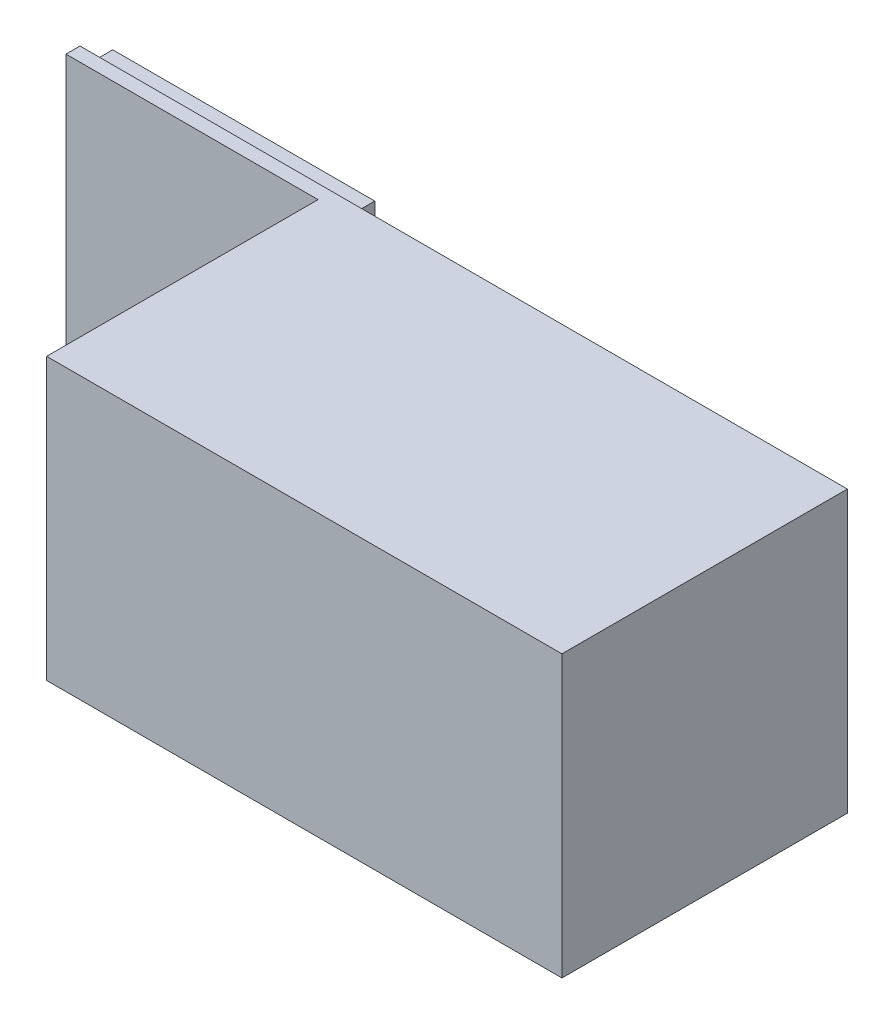
ISO-10303-21;
HEADER;
FILE_DESCRIPTION(('STEP AP214'),'2;1');
FILE_NAME('part.step','',(''),(''),'','','');
FILE_SCHEMA(('AUTOMOTIVE_DESIGN { 1 0 10303 214 1 1 1 1 }'));
ENDSEC;
DATA;
#1=APPLICATION_CONTEXT('core data for automotive mechanical design processes');
#2=APPLICATION_PROTOCOL_DEFINITION('international standard','automotive_design',2000,#1);
#3=PRODUCT_CONTEXT('',#1,'mechanical');
#4=PRODUCT('Part','Part','',(#3));
#5=PRODUCT_RELATED_PRODUCT_CATEGORY('part','',(#4));
#6=PRODUCT_DEFINITION_FORMATION('','',#4);
#7=PRODUCT_DEFINITION_CONTEXT('part definition',#1,'design');
#8=PRODUCT_DEFINITION('design','',#6,#7);
#9=PRODUCT_DEFINITION_SHAPE('','',#8);
#10=(LENGTH_UNIT() NAMED_UNIT(*) SI_UNIT(.MILLI.,.METRE.));
#11=(NAMED_UNIT(*) PLANE_ANGLE_UNIT() SI_UNIT($,.RADIAN.));
#12=(NAMED_UNIT(*) SI_UNIT($,.STERADIAN.) SOLID_ANGLE_UNIT());
#13=UNCERTAINTY_MEASURE_WITH_UNIT(LENGTH_MEASURE(1.E-05),#10,'distance_accuracy_value','');
#14=(GEOMETRIC_REPRESENTATION_CONTEXT(3) GLOBAL_UNCERTAINTY_ASSIGNED_CONTEXT((#13)) GLOBAL_UNIT_ASSIGNED_CONTEXT((#10,
#11,#12)) REPRESENTATION_CONTEXT('',''));
#15=CARTESIAN_POINT('',(0.,0.,0.));
#16=DIRECTION('',(0.,0.,1.));
#17=DIRECTION('',(1.,0.,0.));
#18=AXIS2_PLACEMENT_3D('',#15,#16,#17);
#19=CARTESIAN_POINT('',(-39.0023872675003,12.8992501149212,-3.5));
#20=DIRECTION('',(-1.,0.,0.));
#21=DIRECTION('',(0.,0.,1.));
#22=AXIS2_PLACEMENT_3D('',#19,#20,#21);
#23=PLANE('',#22);
#24=DIRECTION('',(0.,-1.,0.));
#25=VECTOR('',#24,1.);
#26=CARTESIAN_POINT('',(-39.0023872675003,0.,-1.75));
#27=LINE('',#26,#25);
#28=CARTESIAN_POINT('',(-39.0023872675003,12.8992501149212,-1.75));
#29=VERTEX_POINT('',#28);
#30=CARTESIAN_POINT('',(-39.0023872675003,-12.8992501149212,-1.75));
#31=VERTEX_POINT('',#30);
#32=EDGE_CURVE('E255',#29,#31,#27,.T.);
#33=ORIENTED_EDGE('',*,*,#32,.F.);
#34=DIRECTION('',(0.,0.,1.));
#35=VECTOR('',#34,1.);
#36=CARTESIAN_POINT('',(-39.0023872675003,12.8992501149212,-3.5));
#37=LINE('',#36,#35);
#38=CARTESIAN_POINT('',(-39.0023872675003,12.8992501149212,0.));
#39=VERTEX_POINT('',#38);
#40=EDGE_CURVE('E305',#29,#39,#37,.T.);
#41=ORIENTED_EDGE('',*,*,#40,.T.);
#42=DIRECTION('',(0.,-1.,0.));
#43=VECTOR('',#42,1.);
#44=CARTESIAN_POINT('',(-39.0023872675003,12.8992501149212,0.));
#45=LINE('',#44,#43);
#46=CARTESIAN_POINT('',(-39.0023872675003,-12.8992501149212,0.));
#47=VERTEX_POINT('',#46);
#48=EDGE_CURVE('E286',#39,#47,#45,.T.);
#49=ORIENTED_EDGE('',*,*,#48,.T.);
#50=DIRECTION('',(0.,0.,1.));
#51=VECTOR('',#50,1.);
#52=CARTESIAN_POINT('',(-39.0023872675003,-12.8992501149212,-3.5));
#53=LINE('',#52,#51);
#54=EDGE_CURVE('E292',#31,#47,#53,.T.);
#55=ORIENTED_EDGE('',*,*,#54,.F.);
#56=EDGE_LOOP('',(#33,#41,#49,#55));
#57=FACE_BOUND('',#56,.T.);
#58=ADVANCED_FACE('F47',(#57),#23,.F.);
#59=CARTESIAN_POINT('',(0.,0.,0.));
#60=DIRECTION('',(0.,0.,1.));
#61=DIRECTION('',(1.,0.,0.));
#62=AXIS2_PLACEMENT_3D('',#59,#60,#61);
#63=PLANE('',#62);
#64=DIRECTION('',(-1.,0.,0.));
#65=VECTOR('',#64,1.);
#66=CARTESIAN_POINT('',(-39.0023872675003,-12.8992501149212,0.));
#67=LINE('',#66,#65);
#68=CARTESIAN_POINT('',(-41.,-12.8992501149212,0.));
#69=VERTEX_POINT('',#68);
#70=EDGE_CURVE('E280',#47,#69,#67,.T.);
#71=ORIENTED_EDGE('',*,*,#70,.F.);
#72=ORIENTED_EDGE('',*,*,#48,.F.);
#73=DIRECTION('',(1.,0.,0.));
#74=VECTOR('',#73,1.);
#75=CARTESIAN_POINT('',(-41.,12.8992501149212,0.));
#76=LINE('',#75,#74);
#77=CARTESIAN_POINT('',(-41.,12.8992501149212,0.));
#78=VERTEX_POINT('',#77);
#79=EDGE_CURVE('E296',#78,#39,#76,.T.);
#80=ORIENTED_EDGE('',*,*,#79,.F.);
#81=DIRECTION('',(0.,-1.,0.));
#82=VECTOR('',#81,1.);
#83=CARTESIAN_POINT('',(-41.,15.,0.));
#84=LINE('',#83,#82);
#85=CARTESIAN_POINT('',(-41.,15.,0.));
#86=VERTEX_POINT('',#85);
#87=EDGE_CURVE('E336',#86,#78,#84,.T.);
#88=ORIENTED_EDGE('',*,*,#87,.F.);
#89=DIRECTION('',(-1.,0.,0.));
#90=VECTOR('',#89,1.);
#91=CARTESIAN_POINT('',(-41.,15.,0.));
#92=LINE('',#91,#90);
#93=CARTESIAN_POINT('',(41.,15.,0.));
#94=VERTEX_POINT('',#93);
#95=EDGE_CURVE('E332',#94,#86,#92,.T.);
#96=ORIENTED_EDGE('',*,*,#95,.F.);
#97=DIRECTION('',(0.,1.,0.));
#98=VECTOR('',#97,1.);
#99=CARTESIAN_POINT('',(41.,15.,0.));
#100=LINE('',#99,#98);
#101=CARTESIAN_POINT('',(41.,-15.,0.));
#102=VERTEX_POINT('',#101);
#103=EDGE_CURVE('E316',#102,#94,#100,.T.);
#104=ORIENTED_EDGE('',*,*,#103,.F.);
#105=DIRECTION('',(1.,0.,0.));
#106=VECTOR('',#105,1.);
#107=CARTESIAN_POINT('',(-41.,-15.,0.));
#108=LINE('',#107,#106);
#109=CARTESIAN_POINT('',(-41.,-15.,0.));
#110=VERTEX_POINT('',#109);
#111=EDGE_CURVE('E321',#110,#102,#108,.T.);
#112=ORIENTED_EDGE('',*,*,#111,.F.);
#113=EDGE_CURVE('E335',#69,#110,#84,.T.);
#114=ORIENTED_EDGE('',*,*,#113,.F.);
#115=EDGE_LOOP('',(#71,#72,#80,#88,#96,#104,#112,#114));
#116=FACE_BOUND('',#115,.T.);
#117=ADVANCED_FACE('F360',(#116),#63,.F.);
#118=CARTESIAN_POINT('',(41.,15.,1.5));
#119=DIRECTION('',(-1.,0.,0.));
#120=DIRECTION('',(0.,0.,1.));
#121=AXIS2_PLACEMENT_3D('',#118,#119,#120);
#122=PLANE('',#121);
#123=ORIENTED_EDGE('',*,*,#103,.T.);
#124=DIRECTION('',(0.,0.,-1.));
#125=VECTOR('',#124,1.);
#126=CARTESIAN_POINT('',(41.,15.,1.5));
#127=LINE('',#126,#125);
#128=CARTESIAN_POINT('',(41.,15.,30.5));
#129=VERTEX_POINT('',#128);
#130=EDGE_CURVE('E11',#129,#94,#127,.T.);
#131=ORIENTED_EDGE('',*,*,#130,.F.);
#132=DIRECTION('',(0.,1.,0.));
#133=VECTOR('',#132,1.);
#134=CARTESIAN_POINT('',(41.,15.,30.5));
#135=LINE('',#134,#133);
#136=CARTESIAN_POINT('',(41.,-15.,30.5));
#137=VERTEX_POINT('',#136);
#138=EDGE_CURVE('E241',#137,#129,#135,.T.);
#139=ORIENTED_EDGE('',*,*,#138,.F.);
#140=DIRECTION('',(0.,0.,-1.));
#141=VECTOR('',#140,1.);
#142=CARTESIAN_POINT('',(41.,-15.,1.5));
#143=LINE('',#142,#141);
#144=EDGE_CURVE('E328',#137,#102,#143,.T.);
#145=ORIENTED_EDGE('',*,*,#144,.T.);
#146=EDGE_LOOP('',(#123,#131,#139,#145));
#147=FACE_BOUND('',#146,.T.);
#148=ADVANCED_FACE('F49',(#147),#122,.F.);
#149=CARTESIAN_POINT('',(-41.,15.,1.5));
#150=DIRECTION('',(0.,-1.,0.));
#151=DIRECTION('',(0.,0.,-1.));
#152=AXIS2_PLACEMENT_3D('',#149,#150,#151);
#153=PLANE('',#152);
#154=ORIENTED_EDGE('',*,*,#95,.T.);
#155=DIRECTION('',(0.,0.,-1.));
#156=VECTOR('',#155,1.);
#157=CARTESIAN_POINT('',(-41.,15.,1.5));
#158=LINE('',#157,#156);
#159=CARTESIAN_POINT('',(-41.,15.,1.5));
#160=VERTEX_POINT('',#159);
#161=EDGE_CURVE('E56',#160,#86,#158,.T.);
#162=ORIENTED_EDGE('',*,*,#161,.F.);
#163=DIRECTION('',(-1.,0.,0.));
#164=VECTOR('',#163,1.);
#165=CARTESIAN_POINT('',(-41.,15.,1.5));
#166=LINE('',#165,#164);
#167=CARTESIAN_POINT('',(-14.0640967757307,15.,1.5));
#168=VERTEX_POINT('',#167);
#169=EDGE_CURVE('E317',#168,#160,#166,.T.);
#170=ORIENTED_EDGE('',*,*,#169,.F.);
#171=DIRECTION('',(0.,0.,-1.));
#172=VECTOR('',#171,1.);
#173=CARTESIAN_POINT('',(-14.0640967757307,15.,30.5));
#174=LINE('',#173,#172);
#175=CARTESIAN_POINT('',(-14.0640967757307,15.,30.5));
#176=VERTEX_POINT('',#175);
#177=EDGE_CURVE('E251',#176,#168,#174,.T.);
#178=ORIENTED_EDGE('',*,*,#177,.F.);
#179=DIRECTION('',(-1.,0.,0.));
#180=VECTOR('',#179,1.);
#181=CARTESIAN_POINT('',(-14.0640967757307,15.,30.5));
#182=LINE('',#181,#180);
#183=EDGE_CURVE('E230',#129,#176,#182,.T.);
#184=ORIENTED_EDGE('',*,*,#183,.F.);
#185=ORIENTED_EDGE('',*,*,#130,.T.);
#186=EDGE_LOOP('',(#154,#162,#170,#178,#184,#185));
#187=FACE_BOUND('',#186,.T.);
#188=ADVANCED_FACE('F416',(#187),#153,.F.);
#189=CARTESIAN_POINT('',(-41.,15.,1.5));
#190=DIRECTION('',(1.,0.,0.));
#191=DIRECTION('',(0.,0.,-1.));
#192=AXIS2_PLACEMENT_3D('',#189,#190,#191);
#193=PLANE('',#192);
#194=ORIENTED_EDGE('',*,*,#87,.T.);
#195=DIRECTION('',(0.,0.,1.));
#196=VECTOR('',#195,1.);
#197=CARTESIAN_POINT('',(-41.,12.8992501149212,-3.5));
#198=LINE('',#197,#196);
#199=CARTESIAN_POINT('',(-41.,12.8992501149212,-3.5));
#200=VERTEX_POINT('',#199);
#201=EDGE_CURVE('E308',#200,#78,#198,.T.);
#202=ORIENTED_EDGE('',*,*,#201,.F.);
#203=DIRECTION('',(0.,1.,0.));
#204=VECTOR('',#203,1.);
#205=CARTESIAN_POINT('',(-41.,12.8992501149212,-3.5));
#206=LINE('',#205,#204);
#207=CARTESIAN_POINT('',(-41.,-12.8992501149212,-3.5));
#208=VERTEX_POINT('',#207);
#209=EDGE_CURVE('E285',#208,#200,#206,.T.);
#210=ORIENTED_EDGE('',*,*,#209,.F.);
#211=DIRECTION('',(0.,0.,1.));
#212=VECTOR('',#211,1.);
#213=CARTESIAN_POINT('',(-41.,-12.8992501149212,-3.5));
#214=LINE('',#213,#212);
#215=EDGE_CURVE('E312',#208,#69,#214,.T.);
#216=ORIENTED_EDGE('',*,*,#215,.T.);
#217=ORIENTED_EDGE('',*,*,#113,.T.);
#218=DIRECTION('',(0.,0.,-1.));
#219=VECTOR('',#218,1.);
#220=CARTESIAN_POINT('',(-41.,-15.,1.5));
#221=LINE('',#220,#219);
#222=CARTESIAN_POINT('',(-41.,-15.,1.5));
#223=VERTEX_POINT('',#222);
#224=EDGE_CURVE('E345',#223,#110,#221,.T.);
#225=ORIENTED_EDGE('',*,*,#224,.F.);
#226=DIRECTION('',(0.,-1.,0.));
#227=VECTOR('',#226,1.);
#228=CARTESIAN_POINT('',(-41.,15.,1.5));
#229=LINE('',#228,#227);
#230=EDGE_CURVE('E320',#160,#223,#229,.T.);
#231=ORIENTED_EDGE('',*,*,#230,.F.);
#232=ORIENTED_EDGE('',*,*,#161,.T.);
#233=EDGE_LOOP('',(#194,#202,#210,#216,#217,#225,#231,#232));
#234=FACE_BOUND('',#233,.T.);
#235=ADVANCED_FACE('F354',(#234),#193,.F.);
#236=CARTESIAN_POINT('',(-41.,-15.,1.5));
#237=DIRECTION('',(0.,1.,0.));
#238=DIRECTION('',(0.,0.,1.));
#239=AXIS2_PLACEMENT_3D('',#236,#237,#238);
#240=PLANE('',#239);
#241=ORIENTED_EDGE('',*,*,#111,.T.);
#242=ORIENTED_EDGE('',*,*,#144,.F.);
#243=DIRECTION('',(1.,0.,0.));
#244=VECTOR('',#243,1.);
#245=CARTESIAN_POINT('',(41.,-15.,30.5));
#246=LINE('',#245,#244);
#247=CARTESIAN_POINT('',(-14.0640967757307,-15.,30.5));
#248=VERTEX_POINT('',#247);
#249=EDGE_CURVE('E237',#248,#137,#246,.T.);
#250=ORIENTED_EDGE('',*,*,#249,.F.);
#251=DIRECTION('',(0.,0.,-1.));
#252=VECTOR('',#251,1.);
#253=CARTESIAN_POINT('',(-14.0640967757307,-15.,30.5));
#254=LINE('',#253,#252);
#255=CARTESIAN_POINT('',(-14.0640967757307,-15.,1.5));
#256=VERTEX_POINT('',#255);
#257=EDGE_CURVE('E245',#248,#256,#254,.T.);
#258=ORIENTED_EDGE('',*,*,#257,.T.);
#259=DIRECTION('',(1.,0.,0.));
#260=VECTOR('',#259,1.);
#261=CARTESIAN_POINT('',(-41.,-15.,1.5));
#262=LINE('',#261,#260);
#263=EDGE_CURVE('E324',#223,#256,#262,.T.);
#264=ORIENTED_EDGE('',*,*,#263,.F.);
#265=ORIENTED_EDGE('',*,*,#224,.T.);
#266=EDGE_LOOP('',(#241,#242,#250,#258,#264,#265));
#267=FACE_BOUND('',#266,.T.);
#268=ADVANCED_FACE('F410',(#267),#240,.F.);
#269=CARTESIAN_POINT('',(0.,0.,1.5));
#270=DIRECTION('',(0.,0.,1.));
#271=DIRECTION('',(1.,0.,0.));
#272=AXIS2_PLACEMENT_3D('',#269,#270,#271);
#273=PLANE('',#272);
#274=DIRECTION('',(0.,-1.,0.));
#275=VECTOR('',#274,1.);
#276=CARTESIAN_POINT('',(-14.0640967757307,-15.,1.5));
#277=LINE('',#276,#275);
#278=CARTESIAN_POINT('',(-14.0640967757307,14.0374053382993,1.5));
#279=VERTEX_POINT('',#278);
#280=EDGE_CURVE('E71',#168,#279,#277,.T.);
#281=ORIENTED_EDGE('',*,*,#280,.F.);
#282=ORIENTED_EDGE('',*,*,#169,.T.);
#283=ORIENTED_EDGE('',*,*,#230,.T.);
#284=ORIENTED_EDGE('',*,*,#263,.T.);
#285=CARTESIAN_POINT('',(-14.0640967757307,-14.1575543140905,1.5));
#286=VERTEX_POINT('',#285);
#287=EDGE_CURVE('E227',#286,#256,#277,.T.);
#288=ORIENTED_EDGE('',*,*,#287,.F.);
#289=DIRECTION('',(0.,-1.,0.));
#290=VECTOR('',#289,1.);
#291=CARTESIAN_POINT('',(-14.0640967757307,0.,1.5));
#292=LINE('',#291,#290);
#293=EDGE_CURVE('E175',#279,#286,#292,.T.);
#294=ORIENTED_EDGE('',*,*,#293,.F.);
#295=EDGE_LOOP('',(#281,#282,#283,#284,#288,#294));
#296=FACE_BOUND('',#295,.T.);
#297=ADVANCED_FACE('F408',(#296),#273,.T.);
#298=CARTESIAN_POINT('',(-39.0023872675003,-12.8992501149212,-3.5));
#299=DIRECTION('',(0.,1.,0.));
#300=DIRECTION('',(0.,0.,1.));
#301=AXIS2_PLACEMENT_3D('',#298,#299,#300);
#302=PLANE('',#301);
#303=ORIENTED_EDGE('',*,*,#70,.T.);
#304=ORIENTED_EDGE('',*,*,#215,.F.);
#305=DIRECTION('',(-1.,0.,0.));
#306=VECTOR('',#305,1.);
#307=CARTESIAN_POINT('',(-39.0023872675003,-12.8992501149212,-3.5));
#308=LINE('',#307,#306);
#309=CARTESIAN_POINT('',(-13.0023872675003,-12.8992501149212,-3.5));
#310=VERTEX_POINT('',#309);
#311=EDGE_CURVE('E281',#310,#208,#308,.T.);
#312=ORIENTED_EDGE('',*,*,#311,.F.);
#313=DIRECTION('',(0.,0.,-1.));
#314=VECTOR('',#313,1.);
#315=CARTESIAN_POINT('',(-13.0023872675003,-12.8992501149212,0.));
#316=LINE('',#315,#314);
#317=CARTESIAN_POINT('',(-13.0023872675003,-12.8992501149212,-1.75));
#318=VERTEX_POINT('',#317);
#319=EDGE_CURVE('E263',#318,#310,#316,.T.);
#320=ORIENTED_EDGE('',*,*,#319,.F.);
#321=DIRECTION('',(-1.,0.,0.));
#322=VECTOR('',#321,1.);
#323=CARTESIAN_POINT('',(-13.0023872675003,-12.8992501149212,-1.75));
#324=LINE('',#323,#322);
#325=EDGE_CURVE('E271',#318,#31,#324,.T.);
#326=ORIENTED_EDGE('',*,*,#325,.T.);
#327=ORIENTED_EDGE('',*,*,#54,.T.);
#328=EDGE_LOOP('',(#303,#304,#312,#320,#326,#327));
#329=FACE_BOUND('',#328,.T.);
#330=ADVANCED_FACE('F375',(#329),#302,.F.);
#331=CARTESIAN_POINT('',(-41.,12.8992501149212,-3.5));
#332=DIRECTION('',(0.,-1.,0.));
#333=DIRECTION('',(0.,0.,-1.));
#334=AXIS2_PLACEMENT_3D('',#331,#332,#333);
#335=PLANE('',#334);
#336=ORIENTED_EDGE('',*,*,#79,.T.);
#337=ORIENTED_EDGE('',*,*,#40,.F.);
#338=DIRECTION('',(-1.,0.,0.));
#339=VECTOR('',#338,1.);
#340=CARTESIAN_POINT('',(-13.0023872675003,12.8992501149212,-1.75));
#341=LINE('',#340,#339);
#342=CARTESIAN_POINT('',(-13.0023872675003,12.8992501149212,-1.75));
#343=VERTEX_POINT('',#342);
#344=EDGE_CURVE('E277',#343,#29,#341,.T.);
#345=ORIENTED_EDGE('',*,*,#344,.F.);
#346=DIRECTION('',(0.,0.,1.));
#347=VECTOR('',#346,1.);
#348=CARTESIAN_POINT('',(-13.0023872675003,12.8992501149212,0.));
#349=LINE('',#348,#347);
#350=CARTESIAN_POINT('',(-13.0023872675003,12.8992501149212,-3.5));
#351=VERTEX_POINT('',#350);
#352=EDGE_CURVE('E256',#351,#343,#349,.T.);
#353=ORIENTED_EDGE('',*,*,#352,.F.);
#354=DIRECTION('',(1.,0.,0.));
#355=VECTOR('',#354,1.);
#356=CARTESIAN_POINT('',(-41.,12.8992501149212,-3.5));
#357=LINE('',#356,#355);
#358=EDGE_CURVE('E289',#200,#351,#357,.T.);
#359=ORIENTED_EDGE('',*,*,#358,.F.);
#360=ORIENTED_EDGE('',*,*,#201,.T.);
#361=EDGE_LOOP('',(#336,#337,#345,#353,#359,#360));
#362=FACE_BOUND('',#361,.T.);
#363=ADVANCED_FACE('F365',(#362),#335,.F.);
#364=CARTESIAN_POINT('',(0.,0.,-3.5));
#365=DIRECTION('',(0.,0.,1.));
#366=DIRECTION('',(1.,0.,0.));
#367=AXIS2_PLACEMENT_3D('',#364,#365,#366);
#368=PLANE('',#367);
#369=ORIENTED_EDGE('',*,*,#311,.T.);
#370=ORIENTED_EDGE('',*,*,#209,.T.);
#371=ORIENTED_EDGE('',*,*,#358,.T.);
#372=DIRECTION('',(0.,1.,0.));
#373=VECTOR('',#372,1.);
#374=CARTESIAN_POINT('',(-13.0023872675003,0.,-3.5));
#375=LINE('',#374,#373);
#376=EDGE_CURVE('E267',#310,#351,#375,.T.);
#377=ORIENTED_EDGE('',*,*,#376,.F.);
#378=EDGE_LOOP('',(#369,#370,#371,#377));
#379=FACE_BOUND('',#378,.T.);
#380=ADVANCED_FACE('F372',(#379),#368,.F.);
#381=CARTESIAN_POINT('',(-13.0023872675003,0.,-1.75));
#382=DIRECTION('',(0.,0.,-1.));
#383=DIRECTION('',(-1.,0.,0.));
#384=AXIS2_PLACEMENT_3D('',#381,#382,#383);
#385=PLANE('',#384);
#386=ORIENTED_EDGE('',*,*,#32,.T.);
#387=ORIENTED_EDGE('',*,*,#325,.F.);
#388=DIRECTION('',(0.,-1.,0.));
#389=VECTOR('',#388,1.);
#390=CARTESIAN_POINT('',(-13.0023872675003,0.,-1.75));
#391=LINE('',#390,#389);
#392=EDGE_CURVE('E260',#343,#318,#391,.T.);
#393=ORIENTED_EDGE('',*,*,#392,.F.);
#394=ORIENTED_EDGE('',*,*,#344,.T.);
#395=EDGE_LOOP('',(#386,#387,#393,#394));
#396=FACE_BOUND('',#395,.T.);
#397=ADVANCED_FACE('F382',(#396),#385,.F.);
#398=CARTESIAN_POINT('',(-13.0023872675003,0.,0.));
#399=DIRECTION('',(1.,0.,0.));
#400=DIRECTION('',(0.,0.,-1.));
#401=AXIS2_PLACEMENT_3D('',#398,#399,#400);
#402=PLANE('',#401);
#403=ORIENTED_EDGE('',*,*,#352,.T.);
#404=ORIENTED_EDGE('',*,*,#392,.T.);
#405=ORIENTED_EDGE('',*,*,#319,.T.);
#406=ORIENTED_EDGE('',*,*,#376,.T.);
#407=EDGE_LOOP('',(#403,#404,#405,#406));
#408=FACE_BOUND('',#407,.T.);
#409=ADVANCED_FACE('F384',(#408),#402,.T.);
#410=CARTESIAN_POINT('',(-14.0640967757307,-15.,30.5));
#411=DIRECTION('',(1.,0.,0.));
#412=DIRECTION('',(0.,0.,-1.));
#413=AXIS2_PLACEMENT_3D('',#410,#411,#412);
#414=PLANE('',#413);
#415=ORIENTED_EDGE('',*,*,#280,.T.);
#416=DIRECTION('',(0.,0.,-1.));
#417=VECTOR('',#416,1.);
#418=CARTESIAN_POINT('',(-14.0640967757307,14.0374053382993,2.81738964945669));
#419=LINE('',#418,#417);
#420=CARTESIAN_POINT('',(-14.0640967757307,14.0374053382993,29.1700650063779));
#421=VERTEX_POINT('',#420);
#422=EDGE_CURVE('E208',#421,#279,#419,.T.);
#423=ORIENTED_EDGE('',*,*,#422,.F.);
#424=DIRECTION('',(0.,1.,0.));
#425=VECTOR('',#424,1.);
#426=CARTESIAN_POINT('',(-14.0640967757307,14.0374053382993,29.1700650063779));
#427=LINE('',#426,#425);
#428=CARTESIAN_POINT('',(-14.0640967757307,-14.1575543140905,29.1700650063779));
#429=VERTEX_POINT('',#428);
#430=EDGE_CURVE('E218',#429,#421,#427,.T.);
#431=ORIENTED_EDGE('',*,*,#430,.F.);
#432=DIRECTION('',(0.,0.,1.));
#433=VECTOR('',#432,1.);
#434=CARTESIAN_POINT('',(-14.0640967757307,-14.1575543140905,29.1700650063779));
#435=LINE('',#434,#433);
#436=EDGE_CURVE('E63',#286,#429,#435,.T.);
#437=ORIENTED_EDGE('',*,*,#436,.F.);
#438=ORIENTED_EDGE('',*,*,#287,.T.);
#439=ORIENTED_EDGE('',*,*,#257,.F.);
#440=DIRECTION('',(0.,-1.,0.));
#441=VECTOR('',#440,1.);
#442=CARTESIAN_POINT('',(-14.0640967757307,-15.,30.5));
#443=LINE('',#442,#441);
#444=EDGE_CURVE('E234',#176,#248,#443,.T.);
#445=ORIENTED_EDGE('',*,*,#444,.F.);
#446=ORIENTED_EDGE('',*,*,#177,.T.);
#447=EDGE_LOOP('',(#415,#423,#431,#437,#438,#439,#445,#446));
#448=FACE_BOUND('',#447,.T.);
#449=ADVANCED_FACE('F386',(#448),#414,.F.);
#450=CARTESIAN_POINT('',(0.,0.,30.5));
#451=DIRECTION('',(0.,0.,-1.));
#452=DIRECTION('',(-1.,0.,0.));
#453=AXIS2_PLACEMENT_3D('',#450,#451,#452);
#454=PLANE('',#453);
#455=ORIENTED_EDGE('',*,*,#183,.T.);
#456=ORIENTED_EDGE('',*,*,#444,.T.);
#457=ORIENTED_EDGE('',*,*,#249,.T.);
#458=ORIENTED_EDGE('',*,*,#138,.T.);
#459=EDGE_LOOP('',(#455,#456,#457,#458));
#460=FACE_BOUND('',#459,.T.);
#461=ADVANCED_FACE('F392',(#460),#454,.F.);
#462=CARTESIAN_POINT('',(38.9359032242693,-14.1575543140905,29.1700650063779));
#463=DIRECTION('',(0.,-1.,0.));
#464=DIRECTION('',(0.,0.,-1.));
#465=AXIS2_PLACEMENT_3D('',#462,#463,#464);
#466=PLANE('',#465);
#467=ORIENTED_EDGE('',*,*,#436,.T.);
#468=DIRECTION('',(-1.,0.,0.));
#469=VECTOR('',#468,1.);
#470=CARTESIAN_POINT('',(38.9359032242693,-14.1575543140905,29.1700650063779));
#471=LINE('',#470,#469);
#472=CARTESIAN_POINT('',(38.9359032242693,-14.1575543140905,29.1700650063779));
#473=VERTEX_POINT('',#472);
#474=EDGE_CURVE('E215',#473,#429,#471,.T.);
#475=ORIENTED_EDGE('',*,*,#474,.F.);
#476=DIRECTION('',(0.,0.,1.));
#477=VECTOR('',#476,1.);
#478=CARTESIAN_POINT('',(38.9359032242693,-14.1575543140905,29.1700650063779));
#479=LINE('',#478,#477);
#480=CARTESIAN_POINT('',(38.9359032242693,-14.1575543140905,1.49738964945669));
#481=VERTEX_POINT('',#480);
#482=EDGE_CURVE('E185',#481,#473,#479,.T.);
#483=ORIENTED_EDGE('',*,*,#482,.F.);
#484=DIRECTION('',(1.,0.,0.));
#485=VECTOR('',#484,1.);
#486=CARTESIAN_POINT('',(38.9359032242693,-14.1575543140905,1.49738964945669));
#487=LINE('',#486,#485);
#488=CARTESIAN_POINT('',(-14.0640967757307,-14.1575543140905,1.49738964945669));
#489=VERTEX_POINT('',#488);
#490=EDGE_CURVE('E182',#489,#481,#487,.T.);
#491=ORIENTED_EDGE('',*,*,#490,.F.);
#492=DIRECTION('',(0.,0.,1.));
#493=VECTOR('',#492,1.);
#494=CARTESIAN_POINT('',(-14.0640967757307,-14.1575543140905,1.49738964945669));
#495=LINE('',#494,#493);
#496=EDGE_CURVE('E168',#489,#286,#495,.T.);
#497=ORIENTED_EDGE('',*,*,#496,.T.);
#498=EDGE_LOOP('',(#467,#475,#483,#491,#497));
#499=FACE_BOUND('',#498,.T.);
#500=ADVANCED_FACE('F183',(#499),#466,.F.);
#501=CARTESIAN_POINT('',(38.9359032242693,14.0374053382993,2.81738964945669));
#502=DIRECTION('',(0.,1.,0.));
#503=DIRECTION('',(0.,0.,1.));
#504=AXIS2_PLACEMENT_3D('',#501,#502,#503);
#505=PLANE('',#504);
#506=ORIENTED_EDGE('',*,*,#422,.T.);
#507=DIRECTION('',(0.,0.,1.));
#508=VECTOR('',#507,1.);
#509=CARTESIAN_POINT('',(-14.0640967757307,14.0374053382993,1.49738964945669));
#510=LINE('',#509,#508);
#511=CARTESIAN_POINT('',(-14.0640967757307,14.0374053382993,1.49738964945669));
#512=VERTEX_POINT('',#511);
#513=EDGE_CURVE('E178',#512,#279,#510,.T.);
#514=ORIENTED_EDGE('',*,*,#513,.F.);
#515=DIRECTION('',(-1.,0.,0.));
#516=VECTOR('',#515,1.);
#517=CARTESIAN_POINT('',(-14.0640967757307,14.0374053382993,1.49738964945669));
#518=LINE('',#517,#516);
#519=CARTESIAN_POINT('',(38.9359032242693,14.0374053382993,1.49738964945669));
#520=VERTEX_POINT('',#519);
#521=EDGE_CURVE('E179',#520,#512,#518,.T.);
#522=ORIENTED_EDGE('',*,*,#521,.F.);
#523=DIRECTION('',(0.,0.,-1.));
#524=VECTOR('',#523,1.);
#525=CARTESIAN_POINT('',(38.9359032242693,14.0374053382993,2.81738964945669));
#526=LINE('',#525,#524);
#527=CARTESIAN_POINT('',(38.9359032242693,14.0374053382993,29.1700650063779));
#528=VERTEX_POINT('',#527);
#529=EDGE_CURVE('E212',#528,#520,#526,.T.);
#530=ORIENTED_EDGE('',*,*,#529,.F.);
#531=DIRECTION('',(-1.,0.,0.));
#532=VECTOR('',#531,1.);
#533=CARTESIAN_POINT('',(38.9359032242693,14.0374053382993,29.1700650063779));
#534=LINE('',#533,#532);
#535=EDGE_CURVE('E224',#528,#421,#534,.T.);
#536=ORIENTED_EDGE('',*,*,#535,.T.);
#537=EDGE_LOOP('',(#506,#514,#522,#530,#536));
#538=FACE_BOUND('',#537,.T.);
#539=ADVANCED_FACE('F434',(#538),#505,.F.);
#540=CARTESIAN_POINT('',(38.9359032242693,14.0374053382993,29.1700650063779));
#541=DIRECTION('',(0.,0.,1.));
#542=DIRECTION('',(1.,0.,0.));
#543=AXIS2_PLACEMENT_3D('',#540,#541,#542);
#544=PLANE('',#543);
#545=ORIENTED_EDGE('',*,*,#430,.T.);
#546=ORIENTED_EDGE('',*,*,#535,.F.);
#547=DIRECTION('',(0.,1.,0.));
#548=VECTOR('',#547,1.);
#549=CARTESIAN_POINT('',(38.9359032242693,14.0374053382993,29.1700650063779));
#550=LINE('',#549,#548);
#551=EDGE_CURVE('E207',#473,#528,#550,.T.);
#552=ORIENTED_EDGE('',*,*,#551,.F.);
#553=ORIENTED_EDGE('',*,*,#474,.T.);
#554=EDGE_LOOP('',(#545,#546,#552,#553));
#555=FACE_BOUND('',#554,.T.);
#556=ADVANCED_FACE('F438',(#555),#544,.F.);
#557=CARTESIAN_POINT('',(38.9359032242693,0.,0.));
#558=DIRECTION('',(-1.,0.,0.));
#559=DIRECTION('',(0.,0.,1.));
#560=AXIS2_PLACEMENT_3D('',#557,#558,#559);
#561=PLANE('',#560);
#562=ORIENTED_EDGE('',*,*,#482,.T.);
#563=ORIENTED_EDGE('',*,*,#551,.T.);
#564=ORIENTED_EDGE('',*,*,#529,.T.);
#565=DIRECTION('',(0.,1.,0.));
#566=VECTOR('',#565,1.);
#567=CARTESIAN_POINT('',(38.9359032242693,14.0374053382993,1.49738964945669));
#568=LINE('',#567,#566);
#569=EDGE_CURVE('E190',#481,#520,#568,.T.);
#570=ORIENTED_EDGE('',*,*,#569,.F.);
#571=EDGE_LOOP('',(#562,#563,#564,#570));
#572=FACE_BOUND('',#571,.T.);
#573=ADVANCED_FACE('F440',(#572),#561,.T.);
#574=CARTESIAN_POINT('',(-14.0640967757307,-14.1575543140905,1.49738964945669));
#575=DIRECTION('',(-1.,0.,0.));
#576=DIRECTION('',(0.,0.,1.));
#577=AXIS2_PLACEMENT_3D('',#574,#575,#576);
#578=PLANE('',#577);
#579=ORIENTED_EDGE('',*,*,#293,.T.);
#580=ORIENTED_EDGE('',*,*,#496,.F.);
#581=DIRECTION('',(0.,-1.,0.));
#582=VECTOR('',#581,1.);
#583=CARTESIAN_POINT('',(-14.0640967757307,-14.1575543140905,1.49738964945669));
#584=LINE('',#583,#582);
#585=EDGE_CURVE('E173',#512,#489,#584,.T.);
#586=ORIENTED_EDGE('',*,*,#585,.F.);
#587=ORIENTED_EDGE('',*,*,#513,.T.);
#588=EDGE_LOOP('',(#579,#580,#586,#587));
#589=FACE_BOUND('',#588,.T.);
#590=ADVANCED_FACE('F170',(#589),#578,.F.);
#591=CARTESIAN_POINT('',(0.,0.,1.49738964945669));
#592=DIRECTION('',(0.,0.,-1.));
#593=DIRECTION('',(-1.,0.,0.));
#594=AXIS2_PLACEMENT_3D('',#591,#592,#593);
#595=PLANE('',#594);
#596=ORIENTED_EDGE('',*,*,#585,.T.);
#597=ORIENTED_EDGE('',*,*,#490,.T.);
#598=ORIENTED_EDGE('',*,*,#569,.T.);
#599=ORIENTED_EDGE('',*,*,#521,.T.);
#600=EDGE_LOOP('',(#596,#597,#598,#599));
#601=FACE_BOUND('',#600,.T.);
#602=ADVANCED_FACE('F192',(#601),#595,.F.);
#603=CLOSED_SHELL('',(#58,#117,#148,#188,#235,#268,#297,#330,#363,#380,#397,#409,#449,#461,#500,
#539,#556,#573,#590,#602));
#604=MANIFOLD_SOLID_BREP('B2',#603);
#605=ADVANCED_BREP_SHAPE_REPRESENTATION('',(#18,#604),#14);
#606=SHAPE_DEFINITION_REPRESENTATION(#9,#605);
ENDSEC;
END-ISO-10303-21;
